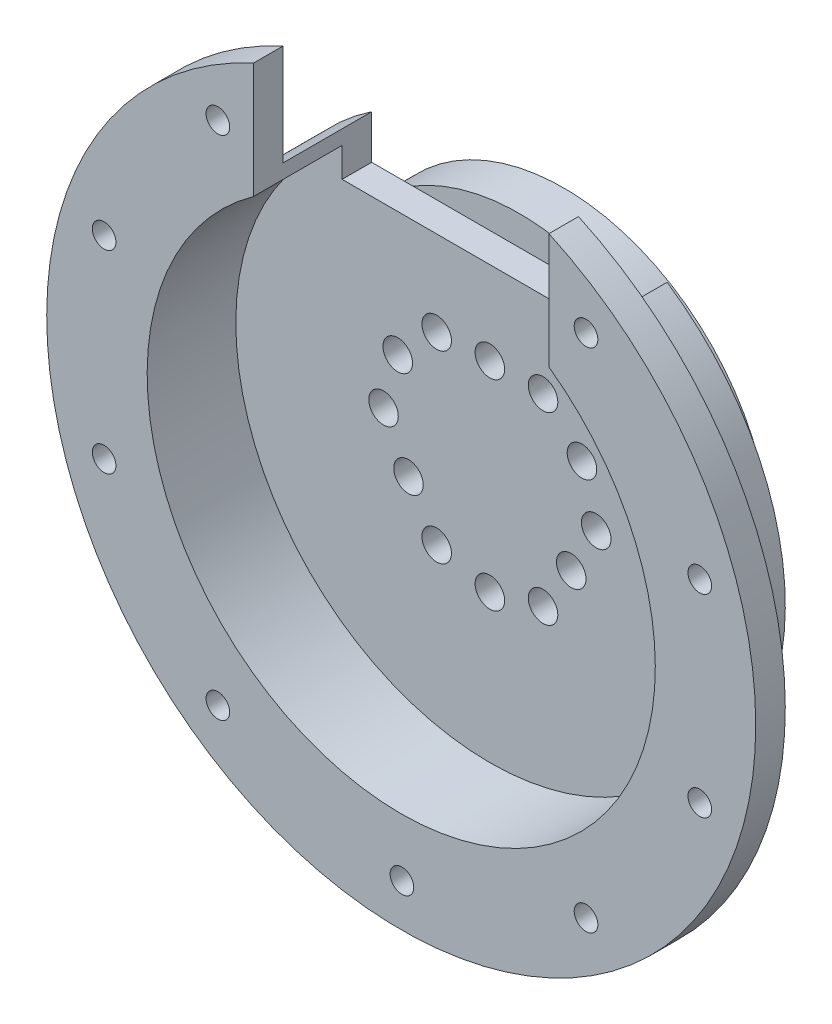
ISO-10303-21;
HEADER;
FILE_DESCRIPTION(('STEP AP214'),'2;1');
FILE_NAME('part.step','',(''),(''),'','','');
FILE_SCHEMA(('AUTOMOTIVE_DESIGN { 1 0 10303 214 1 1 1 1 }'));
ENDSEC;
DATA;
#1=APPLICATION_CONTEXT('core data for automotive mechanical design processes');
#2=APPLICATION_PROTOCOL_DEFINITION('international standard','automotive_design',2000,#1);
#3=PRODUCT_CONTEXT('',#1,'mechanical');
#4=PRODUCT('Part','Part','',(#3));
#5=PRODUCT_RELATED_PRODUCT_CATEGORY('part','',(#4));
#6=PRODUCT_DEFINITION_FORMATION('','',#4);
#7=PRODUCT_DEFINITION_CONTEXT('part definition',#1,'design');
#8=PRODUCT_DEFINITION('design','',#6,#7);
#9=PRODUCT_DEFINITION_SHAPE('','',#8);
#10=(LENGTH_UNIT() NAMED_UNIT(*) SI_UNIT(.MILLI.,.METRE.));
#11=(NAMED_UNIT(*) PLANE_ANGLE_UNIT() SI_UNIT($,.RADIAN.));
#12=(NAMED_UNIT(*) SI_UNIT($,.STERADIAN.) SOLID_ANGLE_UNIT());
#13=UNCERTAINTY_MEASURE_WITH_UNIT(LENGTH_MEASURE(1.E-05),#10,'distance_accuracy_value','');
#14=(GEOMETRIC_REPRESENTATION_CONTEXT(3) GLOBAL_UNCERTAINTY_ASSIGNED_CONTEXT((#13)) GLOBAL_UNIT_ASSIGNED_CONTEXT((#10,
#11,#12)) REPRESENTATION_CONTEXT('',''));
#15=CARTESIAN_POINT('',(0.,0.,0.));
#16=DIRECTION('',(0.,0.,1.));
#17=DIRECTION('',(1.,0.,0.));
#18=AXIS2_PLACEMENT_3D('',#15,#16,#17);
#19=CARTESIAN_POINT('',(0.,0.,5.));
#20=DIRECTION('',(0.,0.,1.));
#21=DIRECTION('',(1.,0.,0.));
#22=AXIS2_PLACEMENT_3D('',#19,#20,#21);
#23=PLANE('',#22);
#24=CARTESIAN_POINT('',(0.,15.9,5.));
#25=DIRECTION('',(0.,0.,1.));
#26=DIRECTION('',(1.,0.,0.));
#27=AXIS2_PLACEMENT_3D('',#24,#25,#26);
#28=CIRCLE('',#27,2.5);
#29=CARTESIAN_POINT('',(2.5,15.9,5.));
#30=VERTEX_POINT('',#29);
#31=EDGE_CURVE('E266',#30,#30,#28,.T.);
#32=ORIENTED_EDGE('',*,*,#31,.F.);
#33=EDGE_LOOP('',(#32));
#34=FACE_BOUND('',#33,.T.);
#35=CARTESIAN_POINT('',(-9.00000000000028,15.5884572681197,5.));
#36=DIRECTION('',(0.,0.,1.));
#37=DIRECTION('',(1.,0.,0.));
#38=AXIS2_PLACEMENT_3D('',#35,#36,#37);
#39=CIRCLE('',#38,2.50000000000036);
#40=CARTESIAN_POINT('',(-6.49999999999992,15.5884572681197,5.));
#41=VERTEX_POINT('',#40);
#42=EDGE_CURVE('E235',#41,#41,#39,.T.);
#43=ORIENTED_EDGE('',*,*,#42,.F.);
#44=EDGE_LOOP('',(#43));
#45=FACE_BOUND('',#44,.T.);
#46=CARTESIAN_POINT('',(-15.5884572681199,8.99999999999926,5.));
#47=DIRECTION('',(0.,0.,1.));
#48=DIRECTION('',(1.,0.,0.));
#49=AXIS2_PLACEMENT_3D('',#46,#47,#48);
#50=CIRCLE('',#49,2.50000000000085);
#51=CARTESIAN_POINT('',(-13.088457268119,8.99999999999926,5.));
#52=VERTEX_POINT('',#51);
#53=EDGE_CURVE('E240',#52,#52,#50,.T.);
#54=ORIENTED_EDGE('',*,*,#53,.F.);
#55=EDGE_LOOP('',(#54));
#56=FACE_BOUND('',#55,.T.);
#57=CARTESIAN_POINT('',(-17.9999999999993,-1.13466467721258E-12,5.));
#58=DIRECTION('',(0.,0.,1.));
#59=DIRECTION('',(1.,0.,0.));
#60=AXIS2_PLACEMENT_3D('',#57,#58,#59);
#61=CIRCLE('',#60,2.50000000000138);
#62=CARTESIAN_POINT('',(-15.499999999998,-1.13466467721258E-12,5.));
#63=VERTEX_POINT('',#62);
#64=EDGE_CURVE('E236',#63,#63,#61,.T.);
#65=ORIENTED_EDGE('',*,*,#64,.F.);
#66=EDGE_LOOP('',(#65));
#67=FACE_BOUND('',#66,.T.);
#68=CARTESIAN_POINT('',(15.5884572681206,9.00000000000035,5.));
#69=DIRECTION('',(0.,0.,1.));
#70=DIRECTION('',(1.,0.,0.));
#71=AXIS2_PLACEMENT_3D('',#68,#69,#70);
#72=CIRCLE('',#71,2.49999999999944);
#73=CARTESIAN_POINT('',(18.08845726812,9.00000000000035,5.));
#74=VERTEX_POINT('',#73);
#75=EDGE_CURVE('E248',#74,#74,#72,.T.);
#76=ORIENTED_EDGE('',*,*,#75,.F.);
#77=EDGE_LOOP('',(#76));
#78=FACE_BOUND('',#77,.T.);
#79=CARTESIAN_POINT('',(-13.7698039201709,-7.95000000000098,5.));
#80=DIRECTION('',(0.,0.,1.));
#81=DIRECTION('',(1.,0.,0.));
#82=AXIS2_PLACEMENT_3D('',#79,#80,#81);
#83=CIRCLE('',#82,2.50000000000204);
#84=CARTESIAN_POINT('',(-11.2698039201688,-7.95000000000098,5.));
#85=VERTEX_POINT('',#84);
#86=EDGE_CURVE('E257',#85,#85,#83,.T.);
#87=ORIENTED_EDGE('',*,*,#86,.F.);
#88=EDGE_LOOP('',(#87));
#89=FACE_BOUND('',#88,.T.);
#90=CARTESIAN_POINT('',(13.7698039201743,-7.94999999999901,5.));
#91=DIRECTION('',(0.,0.,1.));
#92=DIRECTION('',(1.,0.,0.));
#93=AXIS2_PLACEMENT_3D('',#90,#91,#92);
#94=CIRCLE('',#93,2.50000000000142);
#95=CARTESIAN_POINT('',(16.2698039201757,-7.94999999999901,5.));
#96=VERTEX_POINT('',#95);
#97=EDGE_CURVE('E260',#96,#96,#94,.T.);
#98=ORIENTED_EDGE('',*,*,#97,.F.);
#99=EDGE_LOOP('',(#98));
#100=FACE_BOUND('',#99,.T.);
#101=CARTESIAN_POINT('',(9.00000000000002,15.5884572681199,5.));
#102=DIRECTION('',(0.,0.,1.));
#103=DIRECTION('',(1.,0.,0.));
#104=AXIS2_PLACEMENT_3D('',#101,#102,#103);
#105=CIRCLE('',#104,2.5);
#106=CARTESIAN_POINT('',(11.5,15.5884572681199,5.));
#107=VERTEX_POINT('',#106);
#108=EDGE_CURVE('E263',#107,#107,#105,.T.);
#109=ORIENTED_EDGE('',*,*,#108,.F.);
#110=EDGE_LOOP('',(#109));
#111=FACE_BOUND('',#110,.T.);
#112=CARTESIAN_POINT('',(18.0000000000013,2.98451076838273E-13,5.));
#113=DIRECTION('',(0.,0.,1.));
#114=DIRECTION('',(1.,0.,0.));
#115=AXIS2_PLACEMENT_3D('',#112,#113,#114);
#116=CIRCLE('',#115,2.49999999999927);
#117=CARTESIAN_POINT('',(20.5000000000006,2.98451076838273E-13,5.));
#118=VERTEX_POINT('',#117);
#119=EDGE_CURVE('E245',#118,#118,#116,.T.);
#120=ORIENTED_EDGE('',*,*,#119,.F.);
#121=EDGE_LOOP('',(#120));
#122=FACE_BOUND('',#121,.T.);
#123=CARTESIAN_POINT('',(9.00000000000131,-15.5884572681199,5.));
#124=DIRECTION('',(0.,0.,1.));
#125=DIRECTION('',(1.,0.,0.));
#126=AXIS2_PLACEMENT_3D('',#123,#124,#125);
#127=CIRCLE('',#126,2.50000000000036);
#128=CARTESIAN_POINT('',(11.5000000000017,-15.5884572681199,5.));
#129=VERTEX_POINT('',#128);
#130=EDGE_CURVE('E249',#129,#129,#127,.T.);
#131=ORIENTED_EDGE('',*,*,#130,.F.);
#132=EDGE_LOOP('',(#131));
#133=FACE_BOUND('',#132,.T.);
#134=CARTESIAN_POINT('',(1.28825325164736E-12,-18.0000000000008,5.));
#135=DIRECTION('',(0.,0.,1.));
#136=DIRECTION('',(1.,0.,0.));
#137=AXIS2_PLACEMENT_3D('',#134,#135,#136);
#138=CIRCLE('',#137,2.50000000000041);
#139=CARTESIAN_POINT('',(2.50000000000169,-18.0000000000008,5.));
#140=VERTEX_POINT('',#139);
#141=EDGE_CURVE('E252',#140,#140,#138,.T.);
#142=ORIENTED_EDGE('',*,*,#141,.F.);
#143=EDGE_LOOP('',(#142));
#144=FACE_BOUND('',#143,.T.);
#145=CARTESIAN_POINT('',(-8.99999999999908,-15.5884572681212,5.));
#146=DIRECTION('',(0.,0.,1.));
#147=DIRECTION('',(1.,0.,0.));
#148=AXIS2_PLACEMENT_3D('',#145,#146,#147);
#149=CIRCLE('',#148,2.5000000000006);
#150=CARTESIAN_POINT('',(-6.49999999999848,-15.5884572681212,5.));
#151=VERTEX_POINT('',#150);
#152=EDGE_CURVE('E239',#151,#151,#149,.T.);
#153=ORIENTED_EDGE('',*,*,#152,.F.);
#154=EDGE_LOOP('',(#153));
#155=FACE_BOUND('',#154,.T.);
#156=CARTESIAN_POINT('',(0.,0.,5.));
#157=DIRECTION('',(0.,0.,1.));
#158=DIRECTION('',(1.,0.,0.));
#159=AXIS2_PLACEMENT_3D('',#156,#157,#158);
#160=CIRCLE('',#159,43.);
#161=CARTESIAN_POINT('',(25.,34.9857113690718,5.));
#162=VERTEX_POINT('',#161);
#163=CARTESIAN_POINT('',(-25.,34.9857113690718,5.));
#164=VERTEX_POINT('',#163);
#165=EDGE_CURVE('E274',#162,#164,#160,.F.);
#166=ORIENTED_EDGE('',*,*,#165,.F.);
#167=DIRECTION('',(0.,-1.,0.));
#168=VECTOR('',#167,1.);
#169=CARTESIAN_POINT('',(25.,0.,5.));
#170=LINE('',#169,#168);
#171=CARTESIAN_POINT('',(25.,30.,5.));
#172=VERTEX_POINT('',#171);
#173=EDGE_CURVE('E161',#162,#172,#170,.T.);
#174=ORIENTED_EDGE('',*,*,#173,.T.);
#175=DIRECTION('',(-1.,0.,0.));
#176=VECTOR('',#175,1.);
#177=CARTESIAN_POINT('',(0.,30.,5.));
#178=LINE('',#177,#176);
#179=CARTESIAN_POINT('',(-25.,30.,5.));
#180=VERTEX_POINT('',#179);
#181=EDGE_CURVE('E166',#172,#180,#178,.T.);
#182=ORIENTED_EDGE('',*,*,#181,.T.);
#183=DIRECTION('',(0.,1.,0.));
#184=VECTOR('',#183,1.);
#185=CARTESIAN_POINT('',(-25.,0.,5.));
#186=LINE('',#185,#184);
#187=EDGE_CURVE('E147',#180,#164,#186,.T.);
#188=ORIENTED_EDGE('',*,*,#187,.T.);
#189=EDGE_LOOP('',(#166,#174,#182,#188));
#190=FACE_BOUND('',#189,.T.);
#191=ADVANCED_FACE('F37',(#34,#45,#56,#67,#78,#89,#100,#111,#122,#133,#144,#155,#190),#23,.T.);
#192=CARTESIAN_POINT('',(0.,0.,5.));
#193=DIRECTION('',(0.,0.,-1.));
#194=DIRECTION('',(-1.,0.,0.));
#195=AXIS2_PLACEMENT_3D('',#192,#193,#194);
#196=CYLINDRICAL_SURFACE('',#195,45.);
#197=DIRECTION('',(0.,0.,-1.));
#198=VECTOR('',#197,1.);
#199=CARTESIAN_POINT('',(25.,37.4165738677394,4.99999999999999));
#200=LINE('',#199,#198);
#201=CARTESIAN_POINT('',(25.,37.4165738677394,15.));
#202=VERTEX_POINT('',#201);
#203=CARTESIAN_POINT('',(25.,37.4165738677394,0.));
#204=VERTEX_POINT('',#203);
#205=EDGE_CURVE('E159',#202,#204,#200,.T.);
#206=ORIENTED_EDGE('',*,*,#205,.F.);
#207=CARTESIAN_POINT('',(0.,0.,15.));
#208=DIRECTION('',(0.,0.,1.));
#209=DIRECTION('',(1.,0.,0.));
#210=AXIS2_PLACEMENT_3D('',#207,#208,#209);
#211=CIRCLE('',#210,45.);
#212=CARTESIAN_POINT('',(-25.,37.4165738677394,15.));
#213=VERTEX_POINT('',#212);
#214=EDGE_CURVE('E230',#213,#202,#211,.T.);
#215=ORIENTED_EDGE('',*,*,#214,.F.);
#216=DIRECTION('',(0.,0.,-1.));
#217=VECTOR('',#216,1.);
#218=CARTESIAN_POINT('',(-25.,37.4165738677394,5.));
#219=LINE('',#218,#217);
#220=CARTESIAN_POINT('',(-25.,37.4165738677394,0.));
#221=VERTEX_POINT('',#220);
#222=EDGE_CURVE('E145',#221,#213,#219,.F.);
#223=ORIENTED_EDGE('',*,*,#222,.F.);
#224=CARTESIAN_POINT('',(0.,0.,0.));
#225=DIRECTION('',(0.,0.,1.));
#226=DIRECTION('',(1.,0.,0.));
#227=AXIS2_PLACEMENT_3D('',#224,#225,#226);
#228=CIRCLE('',#227,45.);
#229=EDGE_CURVE('E271',#221,#204,#228,.T.);
#230=ORIENTED_EDGE('',*,*,#229,.T.);
#231=EDGE_LOOP('',(#206,#215,#223,#230));
#232=FACE_BOUND('',#231,.T.);
#233=ADVANCED_FACE('F39',(#232),#196,.T.);
#234=CARTESIAN_POINT('',(0.,0.,0.));
#235=DIRECTION('',(0.,0.,1.));
#236=DIRECTION('',(1.,0.,0.));
#237=AXIS2_PLACEMENT_3D('',#234,#235,#236);
#238=PLANE('',#237);
#239=CARTESIAN_POINT('',(0.,0.,0.));
#240=DIRECTION('',(0.,0.,-1.));
#241=DIRECTION('',(-1.,0.,0.));
#242=AXIS2_PLACEMENT_3D('',#239,#240,#241);
#243=CIRCLE('',#242,35.);
#244=CARTESIAN_POINT('',(18.02775637732,30.,0.));
#245=VERTEX_POINT('',#244);
#246=CARTESIAN_POINT('',(-18.02775637732,30.,0.));
#247=VERTEX_POINT('',#246);
#248=EDGE_CURVE('E11',#245,#247,#243,.T.);
#249=ORIENTED_EDGE('',*,*,#248,.F.);
#250=DIRECTION('',(-1.,0.,0.));
#251=VECTOR('',#250,1.);
#252=CARTESIAN_POINT('',(0.,30.,0.));
#253=LINE('',#252,#251);
#254=CARTESIAN_POINT('',(25.,30.,0.));
#255=VERTEX_POINT('',#254);
#256=EDGE_CURVE('E41',#255,#245,#253,.T.);
#257=ORIENTED_EDGE('',*,*,#256,.F.);
#258=DIRECTION('',(0.,-1.,0.));
#259=VECTOR('',#258,1.);
#260=CARTESIAN_POINT('',(25.,0.,0.));
#261=LINE('',#260,#259);
#262=EDGE_CURVE('E164',#204,#255,#261,.T.);
#263=ORIENTED_EDGE('',*,*,#262,.F.);
#264=ORIENTED_EDGE('',*,*,#229,.F.);
#265=DIRECTION('',(0.,1.,0.));
#266=VECTOR('',#265,1.);
#267=CARTESIAN_POINT('',(-25.,0.,0.));
#268=LINE('',#267,#266);
#269=CARTESIAN_POINT('',(-25.,30.,0.));
#270=VERTEX_POINT('',#269);
#271=EDGE_CURVE('E121',#270,#221,#268,.T.);
#272=ORIENTED_EDGE('',*,*,#271,.F.);
#273=EDGE_CURVE('E113',#247,#270,#253,.T.);
#274=ORIENTED_EDGE('',*,*,#273,.F.);
#275=EDGE_LOOP('',(#249,#257,#263,#264,#272,#274));
#276=FACE_BOUND('',#275,.T.);
#277=ADVANCED_FACE('F119',(#276),#238,.F.);
#278=CARTESIAN_POINT('',(0.,0.,15.));
#279=DIRECTION('',(0.,0.,-1.));
#280=DIRECTION('',(-1.,0.,0.));
#281=AXIS2_PLACEMENT_3D('',#278,#279,#280);
#282=CYLINDRICAL_SURFACE('',#281,43.);
#283=CARTESIAN_POINT('',(0.,0.,20.));
#284=DIRECTION('',(0.,0.,1.));
#285=DIRECTION('',(1.,0.,0.));
#286=AXIS2_PLACEMENT_3D('',#283,#284,#285);
#287=CIRCLE('',#286,43.);
#288=CARTESIAN_POINT('',(-25.,34.9857113690718,20.));
#289=VERTEX_POINT('',#288);
#290=CARTESIAN_POINT('',(25.,34.9857113690718,20.));
#291=VERTEX_POINT('',#290);
#292=EDGE_CURVE('E179',#289,#291,#287,.T.);
#293=ORIENTED_EDGE('',*,*,#292,.T.);
#294=DIRECTION('',(0.,0.,-1.));
#295=VECTOR('',#294,1.);
#296=CARTESIAN_POINT('',(25.,34.9857113690718,15.));
#297=LINE('',#296,#295);
#298=EDGE_CURVE('E156',#291,#162,#297,.T.);
#299=ORIENTED_EDGE('',*,*,#298,.T.);
#300=ORIENTED_EDGE('',*,*,#165,.T.);
#301=DIRECTION('',(0.,0.,-1.));
#302=VECTOR('',#301,1.);
#303=CARTESIAN_POINT('',(-25.,34.9857113690718,15.));
#304=LINE('',#303,#302);
#305=EDGE_CURVE('E142',#164,#289,#304,.F.);
#306=ORIENTED_EDGE('',*,*,#305,.T.);
#307=EDGE_LOOP('',(#293,#299,#300,#306));
#308=FACE_BOUND('',#307,.T.);
#309=ADVANCED_FACE('F295',(#308),#282,.F.);
#310=CARTESIAN_POINT('',(0.,0.,20.));
#311=DIRECTION('',(0.,0.,1.));
#312=DIRECTION('',(1.,0.,0.));
#313=AXIS2_PLACEMENT_3D('',#310,#311,#312);
#314=PLANE('',#313);
#315=CARTESIAN_POINT('',(31.2742071689723,43.1431440858981,20.));
#316=DIRECTION('',(0.,0.,1.));
#317=DIRECTION('',(1.,0.,0.));
#318=AXIS2_PLACEMENT_3D('',#315,#316,#317);
#319=CIRCLE('',#318,2.);
#320=CARTESIAN_POINT('',(33.2742071689723,43.1431440858981,20.));
#321=VERTEX_POINT('',#320);
#322=EDGE_CURVE('E176',#321,#321,#319,.T.);
#323=ORIENTED_EDGE('',*,*,#322,.F.);
#324=EDGE_LOOP('',(#323));
#325=FACE_BOUND('',#324,.T.);
#326=CARTESIAN_POINT('',(50.5275841611265,16.6431440859068,20.));
#327=DIRECTION('',(0.,0.,1.));
#328=DIRECTION('',(1.,0.,0.));
#329=AXIS2_PLACEMENT_3D('',#326,#327,#328);
#330=CIRCLE('',#329,2.);
#331=CARTESIAN_POINT('',(52.5275841611265,16.6431440859068,20.));
#332=VERTEX_POINT('',#331);
#333=EDGE_CURVE('E183',#332,#332,#330,.T.);
#334=ORIENTED_EDGE('',*,*,#333,.F.);
#335=EDGE_LOOP('',(#334));
#336=FACE_BOUND('',#335,.T.);
#337=CARTESIAN_POINT('',(50.5275841611413,-16.1126573178377,20.));
#338=DIRECTION('',(0.,0.,1.));
#339=DIRECTION('',(1.,0.,0.));
#340=AXIS2_PLACEMENT_3D('',#337,#338,#339);
#341=CIRCLE('',#340,2.);
#342=CARTESIAN_POINT('',(52.5275841611413,-16.1126573178377,20.));
#343=VERTEX_POINT('',#342);
#344=EDGE_CURVE('E189',#343,#343,#341,.T.);
#345=ORIENTED_EDGE('',*,*,#344,.F.);
#346=EDGE_LOOP('',(#345));
#347=FACE_BOUND('',#346,.T.);
#348=CARTESIAN_POINT('',(31.2742071690112,-42.6126573178465,20.));
#349=DIRECTION('',(0.,0.,1.));
#350=DIRECTION('',(1.,0.,0.));
#351=AXIS2_PLACEMENT_3D('',#348,#349,#350);
#352=CIRCLE('',#351,2.);
#353=CARTESIAN_POINT('',(33.2742071690112,-42.6126573178465,20.));
#354=VERTEX_POINT('',#353);
#355=EDGE_CURVE('E195',#354,#354,#352,.T.);
#356=ORIENTED_EDGE('',*,*,#355,.F.);
#357=EDGE_LOOP('',(#356));
#358=FACE_BOUND('',#357,.T.);
#359=CARTESIAN_POINT('',(0.121588797514564,-52.7347566159883,20.));
#360=DIRECTION('',(0.,0.,1.));
#361=DIRECTION('',(1.,0.,0.));
#362=AXIS2_PLACEMENT_3D('',#359,#360,#361);
#363=CIRCLE('',#362,2.);
#364=CARTESIAN_POINT('',(2.12158879751456,-52.7347566159883,20.));
#365=VERTEX_POINT('',#364);
#366=EDGE_CURVE('E201',#365,#365,#363,.T.);
#367=ORIENTED_EDGE('',*,*,#366,.F.);
#368=EDGE_LOOP('',(#367));
#369=FACE_BOUND('',#368,.T.);
#370=CARTESIAN_POINT('',(-31.0310295739911,-42.6126573178744,20.));
#371=DIRECTION('',(0.,0.,1.));
#372=DIRECTION('',(1.,0.,0.));
#373=AXIS2_PLACEMENT_3D('',#370,#371,#372);
#374=CIRCLE('',#373,2.);
#375=CARTESIAN_POINT('',(-29.0310295739911,-42.6126573178744,20.));
#376=VERTEX_POINT('',#375);
#377=EDGE_CURVE('E207',#376,#376,#374,.T.);
#378=ORIENTED_EDGE('',*,*,#377,.F.);
#379=EDGE_LOOP('',(#378));
#380=FACE_BOUND('',#379,.T.);
#381=CARTESIAN_POINT('',(-50.2844065661451,-16.112657317883,20.));
#382=DIRECTION('',(0.,0.,1.));
#383=DIRECTION('',(1.,0.,0.));
#384=AXIS2_PLACEMENT_3D('',#381,#382,#383);
#385=CIRCLE('',#384,2.);
#386=CARTESIAN_POINT('',(-48.2844065661451,-16.112657317883,20.));
#387=VERTEX_POINT('',#386);
#388=EDGE_CURVE('E213',#387,#387,#385,.T.);
#389=ORIENTED_EDGE('',*,*,#388,.F.);
#390=EDGE_LOOP('',(#389));
#391=FACE_BOUND('',#390,.T.);
#392=CARTESIAN_POINT('',(-50.2844065661597,16.6431440858615,20.));
#393=DIRECTION('',(0.,0.,1.));
#394=DIRECTION('',(1.,0.,0.));
#395=AXIS2_PLACEMENT_3D('',#392,#393,#394);
#396=CIRCLE('',#395,2.);
#397=CARTESIAN_POINT('',(-48.2844065661597,16.6431440858615,20.));
#398=VERTEX_POINT('',#397);
#399=EDGE_CURVE('E219',#398,#398,#396,.T.);
#400=ORIENTED_EDGE('',*,*,#399,.F.);
#401=EDGE_LOOP('',(#400));
#402=FACE_BOUND('',#401,.T.);
#403=CARTESIAN_POINT('',(-31.0310295740293,43.1431440858701,20.));
#404=DIRECTION('',(0.,0.,1.));
#405=DIRECTION('',(1.,0.,0.));
#406=AXIS2_PLACEMENT_3D('',#403,#404,#405);
#407=CIRCLE('',#406,2.);
#408=CARTESIAN_POINT('',(-29.0310295740293,43.1431440858701,20.));
#409=VERTEX_POINT('',#408);
#410=EDGE_CURVE('E170',#409,#409,#407,.T.);
#411=ORIENTED_EDGE('',*,*,#410,.F.);
#412=EDGE_LOOP('',(#411));
#413=FACE_BOUND('',#412,.T.);
#414=CARTESIAN_POINT('',(0.,0.,20.));
#415=DIRECTION('',(0.,0.,1.));
#416=DIRECTION('',(1.,0.,0.));
#417=AXIS2_PLACEMENT_3D('',#414,#415,#416);
#418=CIRCLE('',#417,60.);
#419=CARTESIAN_POINT('',(-25.,54.5435605731786,20.));
#420=VERTEX_POINT('',#419);
#421=CARTESIAN_POINT('',(25.,54.5435605731786,20.));
#422=VERTEX_POINT('',#421);
#423=EDGE_CURVE('E227',#420,#422,#418,.T.);
#424=ORIENTED_EDGE('',*,*,#423,.T.);
#425=DIRECTION('',(0.,-1.,0.));
#426=VECTOR('',#425,1.);
#427=CARTESIAN_POINT('',(25.,0.,20.));
#428=LINE('',#427,#426);
#429=EDGE_CURVE('E153',#422,#291,#428,.T.);
#430=ORIENTED_EDGE('',*,*,#429,.T.);
#431=ORIENTED_EDGE('',*,*,#292,.F.);
#432=DIRECTION('',(0.,1.,0.));
#433=VECTOR('',#432,1.);
#434=CARTESIAN_POINT('',(-25.,0.,20.));
#435=LINE('',#434,#433);
#436=EDGE_CURVE('E139',#289,#420,#435,.T.);
#437=ORIENTED_EDGE('',*,*,#436,.T.);
#438=EDGE_LOOP('',(#424,#430,#431,#437));
#439=FACE_BOUND('',#438,.T.);
#440=ADVANCED_FACE('F293',(#325,#336,#347,#358,#369,#380,#391,#402,#413,#439),#314,.T.);
#441=CARTESIAN_POINT('',(0.,0.,15.));
#442=DIRECTION('',(0.,0.,1.));
#443=DIRECTION('',(1.,0.,0.));
#444=AXIS2_PLACEMENT_3D('',#441,#442,#443);
#445=PLANE('',#444);
#446=CARTESIAN_POINT('',(31.2742071689723,43.1431440858981,15.));
#447=DIRECTION('',(0.,0.,1.));
#448=DIRECTION('',(1.,0.,0.));
#449=AXIS2_PLACEMENT_3D('',#446,#447,#448);
#450=CIRCLE('',#449,2.);
#451=CARTESIAN_POINT('',(33.2742071689723,43.1431440858981,15.));
#452=VERTEX_POINT('',#451);
#453=EDGE_CURVE('E180',#452,#452,#450,.T.);
#454=ORIENTED_EDGE('',*,*,#453,.T.);
#455=EDGE_LOOP('',(#454));
#456=FACE_BOUND('',#455,.T.);
#457=CARTESIAN_POINT('',(50.5275841611265,16.6431440859068,15.));
#458=DIRECTION('',(0.,0.,1.));
#459=DIRECTION('',(1.,0.,0.));
#460=AXIS2_PLACEMENT_3D('',#457,#458,#459);
#461=CIRCLE('',#460,2.);
#462=CARTESIAN_POINT('',(52.5275841611265,16.6431440859068,15.));
#463=VERTEX_POINT('',#462);
#464=EDGE_CURVE('E186',#463,#463,#461,.T.);
#465=ORIENTED_EDGE('',*,*,#464,.T.);
#466=EDGE_LOOP('',(#465));
#467=FACE_BOUND('',#466,.T.);
#468=CARTESIAN_POINT('',(50.5275841611413,-16.1126573178377,15.));
#469=DIRECTION('',(0.,0.,1.));
#470=DIRECTION('',(1.,0.,0.));
#471=AXIS2_PLACEMENT_3D('',#468,#469,#470);
#472=CIRCLE('',#471,2.);
#473=CARTESIAN_POINT('',(52.5275841611413,-16.1126573178377,15.));
#474=VERTEX_POINT('',#473);
#475=EDGE_CURVE('E192',#474,#474,#472,.T.);
#476=ORIENTED_EDGE('',*,*,#475,.T.);
#477=EDGE_LOOP('',(#476));
#478=FACE_BOUND('',#477,.T.);
#479=CARTESIAN_POINT('',(31.2742071690112,-42.6126573178465,15.));
#480=DIRECTION('',(0.,0.,1.));
#481=DIRECTION('',(1.,0.,0.));
#482=AXIS2_PLACEMENT_3D('',#479,#480,#481);
#483=CIRCLE('',#482,2.);
#484=CARTESIAN_POINT('',(33.2742071690112,-42.6126573178465,15.));
#485=VERTEX_POINT('',#484);
#486=EDGE_CURVE('E198',#485,#485,#483,.T.);
#487=ORIENTED_EDGE('',*,*,#486,.T.);
#488=EDGE_LOOP('',(#487));
#489=FACE_BOUND('',#488,.T.);
#490=CARTESIAN_POINT('',(0.121588797514564,-52.7347566159883,15.));
#491=DIRECTION('',(0.,0.,1.));
#492=DIRECTION('',(1.,0.,0.));
#493=AXIS2_PLACEMENT_3D('',#490,#491,#492);
#494=CIRCLE('',#493,2.);
#495=CARTESIAN_POINT('',(2.12158879751456,-52.7347566159883,15.));
#496=VERTEX_POINT('',#495);
#497=EDGE_CURVE('E204',#496,#496,#494,.T.);
#498=ORIENTED_EDGE('',*,*,#497,.T.);
#499=EDGE_LOOP('',(#498));
#500=FACE_BOUND('',#499,.T.);
#501=CARTESIAN_POINT('',(-31.0310295739911,-42.6126573178744,15.));
#502=DIRECTION('',(0.,0.,1.));
#503=DIRECTION('',(1.,0.,0.));
#504=AXIS2_PLACEMENT_3D('',#501,#502,#503);
#505=CIRCLE('',#504,2.);
#506=CARTESIAN_POINT('',(-29.0310295739911,-42.6126573178744,15.));
#507=VERTEX_POINT('',#506);
#508=EDGE_CURVE('E210',#507,#507,#505,.T.);
#509=ORIENTED_EDGE('',*,*,#508,.T.);
#510=EDGE_LOOP('',(#509));
#511=FACE_BOUND('',#510,.T.);
#512=CARTESIAN_POINT('',(-50.2844065661451,-16.112657317883,15.));
#513=DIRECTION('',(0.,0.,1.));
#514=DIRECTION('',(1.,0.,0.));
#515=AXIS2_PLACEMENT_3D('',#512,#513,#514);
#516=CIRCLE('',#515,2.);
#517=CARTESIAN_POINT('',(-48.2844065661451,-16.112657317883,15.));
#518=VERTEX_POINT('',#517);
#519=EDGE_CURVE('E216',#518,#518,#516,.T.);
#520=ORIENTED_EDGE('',*,*,#519,.T.);
#521=EDGE_LOOP('',(#520));
#522=FACE_BOUND('',#521,.T.);
#523=CARTESIAN_POINT('',(-50.2844065661597,16.6431440858615,15.));
#524=DIRECTION('',(0.,0.,1.));
#525=DIRECTION('',(1.,0.,0.));
#526=AXIS2_PLACEMENT_3D('',#523,#524,#525);
#527=CIRCLE('',#526,2.);
#528=CARTESIAN_POINT('',(-48.2844065661597,16.6431440858615,15.));
#529=VERTEX_POINT('',#528);
#530=EDGE_CURVE('E173',#529,#529,#527,.T.);
#531=ORIENTED_EDGE('',*,*,#530,.T.);
#532=EDGE_LOOP('',(#531));
#533=FACE_BOUND('',#532,.T.);
#534=CARTESIAN_POINT('',(-31.0310295740293,43.1431440858701,15.));
#535=DIRECTION('',(0.,0.,1.));
#536=DIRECTION('',(1.,0.,0.));
#537=AXIS2_PLACEMENT_3D('',#534,#535,#536);
#538=CIRCLE('',#537,2.);
#539=CARTESIAN_POINT('',(-29.0310295740293,43.1431440858701,15.));
#540=VERTEX_POINT('',#539);
#541=EDGE_CURVE('E169',#540,#540,#538,.T.);
#542=ORIENTED_EDGE('',*,*,#541,.T.);
#543=EDGE_LOOP('',(#542));
#544=FACE_BOUND('',#543,.T.);
#545=DIRECTION('',(0.,-1.,0.));
#546=VECTOR('',#545,1.);
#547=CARTESIAN_POINT('',(25.,0.,15.));
#548=LINE('',#547,#546);
#549=CARTESIAN_POINT('',(25.,54.5435605731786,15.));
#550=VERTEX_POINT('',#549);
#551=EDGE_CURVE('E151',#550,#202,#548,.T.);
#552=ORIENTED_EDGE('',*,*,#551,.F.);
#553=CARTESIAN_POINT('',(0.,0.,15.));
#554=DIRECTION('',(0.,0.,1.));
#555=DIRECTION('',(1.,0.,0.));
#556=AXIS2_PLACEMENT_3D('',#553,#554,#555);
#557=CIRCLE('',#556,60.);
#558=CARTESIAN_POINT('',(-25.,54.5435605731786,15.));
#559=VERTEX_POINT('',#558);
#560=EDGE_CURVE('E226',#559,#550,#557,.T.);
#561=ORIENTED_EDGE('',*,*,#560,.F.);
#562=DIRECTION('',(0.,1.,0.));
#563=VECTOR('',#562,1.);
#564=CARTESIAN_POINT('',(-25.,0.,15.));
#565=LINE('',#564,#563);
#566=EDGE_CURVE('E60',#213,#559,#565,.T.);
#567=ORIENTED_EDGE('',*,*,#566,.F.);
#568=ORIENTED_EDGE('',*,*,#214,.T.);
#569=EDGE_LOOP('',(#552,#561,#567,#568));
#570=FACE_BOUND('',#569,.T.);
#571=ADVANCED_FACE('F287',(#456,#467,#478,#489,#500,#511,#522,#533,#544,#570),#445,.F.);
#572=CARTESIAN_POINT('',(0.,0.,20.));
#573=DIRECTION('',(0.,0.,-1.));
#574=DIRECTION('',(-1.,0.,0.));
#575=AXIS2_PLACEMENT_3D('',#572,#573,#574);
#576=CYLINDRICAL_SURFACE('',#575,60.);
#577=DIRECTION('',(0.,0.,-1.));
#578=VECTOR('',#577,1.);
#579=CARTESIAN_POINT('',(25.,54.5435605731786,20.));
#580=LINE('',#579,#578);
#581=EDGE_CURVE('E122',#422,#550,#580,.T.);
#582=ORIENTED_EDGE('',*,*,#581,.F.);
#583=ORIENTED_EDGE('',*,*,#423,.F.);
#584=DIRECTION('',(0.,0.,-1.));
#585=VECTOR('',#584,1.);
#586=CARTESIAN_POINT('',(-25.,54.5435605731786,20.));
#587=LINE('',#586,#585);
#588=EDGE_CURVE('E277',#559,#420,#587,.F.);
#589=ORIENTED_EDGE('',*,*,#588,.F.);
#590=ORIENTED_EDGE('',*,*,#560,.T.);
#591=EDGE_LOOP('',(#582,#583,#589,#590));
#592=FACE_BOUND('',#591,.T.);
#593=ADVANCED_FACE('F289',(#592),#576,.T.);
#594=CARTESIAN_POINT('',(0.,15.9,0.));
#595=DIRECTION('',(0.,0.,1.));
#596=DIRECTION('',(1.,0.,0.));
#597=AXIS2_PLACEMENT_3D('',#594,#595,#596);
#598=CYLINDRICAL_SURFACE('',#597,2.5);
#599=ORIENTED_EDGE('',*,*,#31,.T.);
#600=EDGE_LOOP('',(#599));
#601=FACE_BOUND('',#600,.T.);
#602=CARTESIAN_POINT('',(0.,15.9,-7.5));
#603=DIRECTION('',(0.,0.,-1.));
#604=DIRECTION('',(-1.,0.,0.));
#605=AXIS2_PLACEMENT_3D('',#602,#603,#604);
#606=CIRCLE('',#605,2.5);
#607=CARTESIAN_POINT('',(-2.5,15.9,-7.5));
#608=VERTEX_POINT('',#607);
#609=EDGE_CURVE('E427',#608,#608,#606,.T.);
#610=ORIENTED_EDGE('',*,*,#609,.T.);
#611=EDGE_LOOP('',(#610));
#612=FACE_BOUND('',#611,.T.);
#613=ADVANCED_FACE('F314',(#601,#612),#598,.F.);
#614=CARTESIAN_POINT('',(-9.00000000000028,15.5884572681197,0.));
#615=DIRECTION('',(0.,0.,1.));
#616=DIRECTION('',(1.,0.,0.));
#617=AXIS2_PLACEMENT_3D('',#614,#615,#616);
#618=CYLINDRICAL_SURFACE('',#617,2.50000000000036);
#619=ORIENTED_EDGE('',*,*,#42,.T.);
#620=EDGE_LOOP('',(#619));
#621=FACE_BOUND('',#620,.T.);
#622=CARTESIAN_POINT('',(-9.00000000000028,15.5884572681197,-7.5));
#623=DIRECTION('',(0.,0.,-1.));
#624=DIRECTION('',(-1.,0.,0.));
#625=AXIS2_PLACEMENT_3D('',#622,#623,#624);
#626=CIRCLE('',#625,2.50000000000036);
#627=CARTESIAN_POINT('',(-11.5000000000006,15.5884572681197,-7.5));
#628=VERTEX_POINT('',#627);
#629=EDGE_CURVE('E466',#628,#628,#626,.T.);
#630=ORIENTED_EDGE('',*,*,#629,.T.);
#631=EDGE_LOOP('',(#630));
#632=FACE_BOUND('',#631,.T.);
#633=ADVANCED_FACE('F317',(#621,#632),#618,.F.);
#634=CARTESIAN_POINT('',(-15.5884572681199,8.99999999999926,0.));
#635=DIRECTION('',(0.,0.,1.));
#636=DIRECTION('',(1.,0.,0.));
#637=AXIS2_PLACEMENT_3D('',#634,#635,#636);
#638=CYLINDRICAL_SURFACE('',#637,2.50000000000085);
#639=ORIENTED_EDGE('',*,*,#53,.T.);
#640=EDGE_LOOP('',(#639));
#641=FACE_BOUND('',#640,.T.);
#642=CARTESIAN_POINT('',(-15.5884572681199,8.99999999999926,-7.5));
#643=DIRECTION('',(0.,0.,-1.));
#644=DIRECTION('',(-1.,0.,0.));
#645=AXIS2_PLACEMENT_3D('',#642,#643,#644);
#646=CIRCLE('',#645,2.50000000000085);
#647=CARTESIAN_POINT('',(-18.0884572681207,8.99999999999926,-7.5));
#648=VERTEX_POINT('',#647);
#649=EDGE_CURVE('E431',#648,#648,#646,.T.);
#650=ORIENTED_EDGE('',*,*,#649,.T.);
#651=EDGE_LOOP('',(#650));
#652=FACE_BOUND('',#651,.T.);
#653=ADVANCED_FACE('F355',(#641,#652),#638,.F.);
#654=CARTESIAN_POINT('',(-17.9999999999993,-1.13466467721258E-12,0.));
#655=DIRECTION('',(0.,0.,1.));
#656=DIRECTION('',(1.,0.,0.));
#657=AXIS2_PLACEMENT_3D('',#654,#655,#656);
#658=CYLINDRICAL_SURFACE('',#657,2.50000000000138);
#659=ORIENTED_EDGE('',*,*,#64,.T.);
#660=EDGE_LOOP('',(#659));
#661=FACE_BOUND('',#660,.T.);
#662=CARTESIAN_POINT('',(-17.9999999999993,-1.13466467721258E-12,-7.5));
#663=DIRECTION('',(0.,0.,-1.));
#664=DIRECTION('',(-1.,0.,0.));
#665=AXIS2_PLACEMENT_3D('',#662,#663,#664);
#666=CIRCLE('',#665,2.50000000000138);
#667=CARTESIAN_POINT('',(-20.5000000000007,-1.13466467721258E-12,-7.5));
#668=VERTEX_POINT('',#667);
#669=EDGE_CURVE('E462',#668,#668,#666,.T.);
#670=ORIENTED_EDGE('',*,*,#669,.T.);
#671=EDGE_LOOP('',(#670));
#672=FACE_BOUND('',#671,.T.);
#673=ADVANCED_FACE('F332',(#661,#672),#658,.F.);
#674=CARTESIAN_POINT('',(15.5884572681206,9.00000000000035,0.));
#675=DIRECTION('',(0.,0.,1.));
#676=DIRECTION('',(1.,0.,0.));
#677=AXIS2_PLACEMENT_3D('',#674,#675,#676);
#678=CYLINDRICAL_SURFACE('',#677,2.49999999999944);
#679=ORIENTED_EDGE('',*,*,#75,.T.);
#680=EDGE_LOOP('',(#679));
#681=FACE_BOUND('',#680,.T.);
#682=CARTESIAN_POINT('',(15.5884572681206,9.00000000000035,-7.5));
#683=DIRECTION('',(0.,0.,-1.));
#684=DIRECTION('',(-1.,0.,0.));
#685=AXIS2_PLACEMENT_3D('',#682,#683,#684);
#686=CIRCLE('',#685,2.49999999999944);
#687=CARTESIAN_POINT('',(13.0884572681211,9.00000000000035,-7.5));
#688=VERTEX_POINT('',#687);
#689=EDGE_CURVE('E127',#688,#688,#686,.T.);
#690=ORIENTED_EDGE('',*,*,#689,.T.);
#691=EDGE_LOOP('',(#690));
#692=FACE_BOUND('',#691,.T.);
#693=ADVANCED_FACE('F329',(#681,#692),#678,.F.);
#694=CARTESIAN_POINT('',(-13.7698039201709,-7.95000000000098,0.));
#695=DIRECTION('',(0.,0.,1.));
#696=DIRECTION('',(1.,0.,0.));
#697=AXIS2_PLACEMENT_3D('',#694,#695,#696);
#698=CYLINDRICAL_SURFACE('',#697,2.50000000000204);
#699=ORIENTED_EDGE('',*,*,#86,.T.);
#700=EDGE_LOOP('',(#699));
#701=FACE_BOUND('',#700,.T.);
#702=CARTESIAN_POINT('',(-13.7698039201709,-7.95000000000098,-7.5));
#703=DIRECTION('',(0.,0.,-1.));
#704=DIRECTION('',(-1.,0.,0.));
#705=AXIS2_PLACEMENT_3D('',#702,#703,#704);
#706=CIRCLE('',#705,2.50000000000204);
#707=CARTESIAN_POINT('',(-16.2698039201729,-7.95000000000098,-7.5));
#708=VERTEX_POINT('',#707);
#709=EDGE_CURVE('E435',#708,#708,#706,.T.);
#710=ORIENTED_EDGE('',*,*,#709,.T.);
#711=EDGE_LOOP('',(#710));
#712=FACE_BOUND('',#711,.T.);
#713=ADVANCED_FACE('F323',(#701,#712),#698,.F.);
#714=CARTESIAN_POINT('',(13.7698039201743,-7.94999999999901,0.));
#715=DIRECTION('',(0.,0.,1.));
#716=DIRECTION('',(1.,0.,0.));
#717=AXIS2_PLACEMENT_3D('',#714,#715,#716);
#718=CYLINDRICAL_SURFACE('',#717,2.50000000000142);
#719=ORIENTED_EDGE('',*,*,#97,.T.);
#720=EDGE_LOOP('',(#719));
#721=FACE_BOUND('',#720,.T.);
#722=CARTESIAN_POINT('',(13.7698039201743,-7.94999999999901,-7.5));
#723=DIRECTION('',(0.,0.,-1.));
#724=DIRECTION('',(-1.,0.,0.));
#725=AXIS2_PLACEMENT_3D('',#722,#723,#724);
#726=CIRCLE('',#725,2.50000000000142);
#727=CARTESIAN_POINT('',(11.2698039201729,-7.94999999999901,-7.5));
#728=VERTEX_POINT('',#727);
#729=EDGE_CURVE('E443',#728,#728,#726,.T.);
#730=ORIENTED_EDGE('',*,*,#729,.T.);
#731=EDGE_LOOP('',(#730));
#732=FACE_BOUND('',#731,.T.);
#733=ADVANCED_FACE('F319',(#721,#732),#718,.F.);
#734=CARTESIAN_POINT('',(9.00000000000002,15.5884572681199,0.));
#735=DIRECTION('',(0.,0.,1.));
#736=DIRECTION('',(1.,0.,0.));
#737=AXIS2_PLACEMENT_3D('',#734,#735,#736);
#738=CYLINDRICAL_SURFACE('',#737,2.5);
#739=ORIENTED_EDGE('',*,*,#108,.T.);
#740=EDGE_LOOP('',(#739));
#741=FACE_BOUND('',#740,.T.);
#742=CARTESIAN_POINT('',(9.00000000000002,15.5884572681199,-7.5));
#743=DIRECTION('',(0.,0.,-1.));
#744=DIRECTION('',(-1.,0.,0.));
#745=AXIS2_PLACEMENT_3D('',#742,#743,#744);
#746=CIRCLE('',#745,2.5);
#747=CARTESIAN_POINT('',(6.50000000000002,15.5884572681199,-7.5));
#748=VERTEX_POINT('',#747);
#749=EDGE_CURVE('E469',#748,#748,#746,.T.);
#750=ORIENTED_EDGE('',*,*,#749,.T.);
#751=EDGE_LOOP('',(#750));
#752=FACE_BOUND('',#751,.T.);
#753=ADVANCED_FACE('F322',(#741,#752),#738,.F.);
#754=CARTESIAN_POINT('',(18.0000000000013,2.98451076838273E-13,0.));
#755=DIRECTION('',(0.,0.,1.));
#756=DIRECTION('',(1.,0.,0.));
#757=AXIS2_PLACEMENT_3D('',#754,#755,#756);
#758=CYLINDRICAL_SURFACE('',#757,2.49999999999927);
#759=ORIENTED_EDGE('',*,*,#119,.T.);
#760=EDGE_LOOP('',(#759));
#761=FACE_BOUND('',#760,.T.);
#762=CARTESIAN_POINT('',(18.0000000000013,2.98451076838273E-13,-7.5));
#763=DIRECTION('',(0.,0.,-1.));
#764=DIRECTION('',(-1.,0.,0.));
#765=AXIS2_PLACEMENT_3D('',#762,#763,#764);
#766=CIRCLE('',#765,2.49999999999927);
#767=CARTESIAN_POINT('',(15.5000000000021,2.98451076838273E-13,-7.5));
#768=VERTEX_POINT('',#767);
#769=EDGE_CURVE('E132',#768,#768,#766,.T.);
#770=ORIENTED_EDGE('',*,*,#769,.T.);
#771=EDGE_LOOP('',(#770));
#772=FACE_BOUND('',#771,.T.);
#773=ADVANCED_FACE('F327',(#761,#772),#758,.F.);
#774=CARTESIAN_POINT('',(9.00000000000131,-15.5884572681199,0.));
#775=DIRECTION('',(0.,0.,1.));
#776=DIRECTION('',(1.,0.,0.));
#777=AXIS2_PLACEMENT_3D('',#774,#775,#776);
#778=CYLINDRICAL_SURFACE('',#777,2.50000000000036);
#779=ORIENTED_EDGE('',*,*,#130,.T.);
#780=EDGE_LOOP('',(#779));
#781=FACE_BOUND('',#780,.T.);
#782=CARTESIAN_POINT('',(9.00000000000131,-15.5884572681199,-7.5));
#783=DIRECTION('',(0.,0.,-1.));
#784=DIRECTION('',(-1.,0.,0.));
#785=AXIS2_PLACEMENT_3D('',#782,#783,#784);
#786=CIRCLE('',#785,2.50000000000036);
#787=CARTESIAN_POINT('',(6.50000000000095,-15.5884572681199,-7.5));
#788=VERTEX_POINT('',#787);
#789=EDGE_CURVE('E454',#788,#788,#786,.T.);
#790=ORIENTED_EDGE('',*,*,#789,.T.);
#791=EDGE_LOOP('',(#790));
#792=FACE_BOUND('',#791,.T.);
#793=ADVANCED_FACE('F345',(#781,#792),#778,.F.);
#794=CARTESIAN_POINT('',(1.28825325164736E-12,-18.0000000000008,0.));
#795=DIRECTION('',(0.,0.,1.));
#796=DIRECTION('',(1.,0.,0.));
#797=AXIS2_PLACEMENT_3D('',#794,#795,#796);
#798=CYLINDRICAL_SURFACE('',#797,2.50000000000041);
#799=ORIENTED_EDGE('',*,*,#141,.T.);
#800=EDGE_LOOP('',(#799));
#801=FACE_BOUND('',#800,.T.);
#802=CARTESIAN_POINT('',(1.28825325164736E-12,-18.0000000000008,-7.5));
#803=DIRECTION('',(0.,0.,-1.));
#804=DIRECTION('',(-1.,0.,0.));
#805=AXIS2_PLACEMENT_3D('',#802,#803,#804);
#806=CIRCLE('',#805,2.50000000000041);
#807=CARTESIAN_POINT('',(-2.49999999999912,-18.0000000000008,-7.5));
#808=VERTEX_POINT('',#807);
#809=EDGE_CURVE('E439',#808,#808,#806,.T.);
#810=ORIENTED_EDGE('',*,*,#809,.T.);
#811=EDGE_LOOP('',(#810));
#812=FACE_BOUND('',#811,.T.);
#813=ADVANCED_FACE('F341',(#801,#812),#798,.F.);
#814=CARTESIAN_POINT('',(-8.99999999999908,-15.5884572681212,0.));
#815=DIRECTION('',(0.,0.,1.));
#816=DIRECTION('',(1.,0.,0.));
#817=AXIS2_PLACEMENT_3D('',#814,#815,#816);
#818=CYLINDRICAL_SURFACE('',#817,2.5000000000006);
#819=ORIENTED_EDGE('',*,*,#152,.T.);
#820=EDGE_LOOP('',(#819));
#821=FACE_BOUND('',#820,.T.);
#822=CARTESIAN_POINT('',(-8.99999999999908,-15.5884572681212,-7.5));
#823=DIRECTION('',(0.,0.,-1.));
#824=DIRECTION('',(-1.,0.,0.));
#825=AXIS2_PLACEMENT_3D('',#822,#823,#824);
#826=CIRCLE('',#825,2.5000000000006);
#827=CARTESIAN_POINT('',(-11.4999999999997,-15.5884572681212,-7.5));
#828=VERTEX_POINT('',#827);
#829=EDGE_CURVE('E458',#828,#828,#826,.T.);
#830=ORIENTED_EDGE('',*,*,#829,.T.);
#831=EDGE_LOOP('',(#830));
#832=FACE_BOUND('',#831,.T.);
#833=ADVANCED_FACE('F337',(#821,#832),#818,.F.);
#834=CARTESIAN_POINT('',(31.2742071689723,43.1431440858981,15.));
#835=DIRECTION('',(0.,0.,1.));
#836=DIRECTION('',(1.,0.,0.));
#837=AXIS2_PLACEMENT_3D('',#834,#835,#836);
#838=CYLINDRICAL_SURFACE('',#837,2.);
#839=ORIENTED_EDGE('',*,*,#453,.F.);
#840=EDGE_LOOP('',(#839));
#841=FACE_BOUND('',#840,.T.);
#842=ORIENTED_EDGE('',*,*,#322,.T.);
#843=EDGE_LOOP('',(#842));
#844=FACE_BOUND('',#843,.T.);
#845=ADVANCED_FACE('F340',(#841,#844),#838,.F.);
#846=CARTESIAN_POINT('',(50.5275841611265,16.6431440859068,15.));
#847=DIRECTION('',(0.,0.,1.));
#848=DIRECTION('',(1.,0.,0.));
#849=AXIS2_PLACEMENT_3D('',#846,#847,#848);
#850=CYLINDRICAL_SURFACE('',#849,2.);
#851=ORIENTED_EDGE('',*,*,#464,.F.);
#852=EDGE_LOOP('',(#851));
#853=FACE_BOUND('',#852,.T.);
#854=ORIENTED_EDGE('',*,*,#333,.T.);
#855=EDGE_LOOP('',(#854));
#856=FACE_BOUND('',#855,.T.);
#857=ADVANCED_FACE('F397',(#853,#856),#850,.F.);
#858=CARTESIAN_POINT('',(50.5275841611413,-16.1126573178377,15.));
#859=DIRECTION('',(0.,0.,1.));
#860=DIRECTION('',(1.,0.,0.));
#861=AXIS2_PLACEMENT_3D('',#858,#859,#860);
#862=CYLINDRICAL_SURFACE('',#861,2.);
#863=ORIENTED_EDGE('',*,*,#475,.F.);
#864=EDGE_LOOP('',(#863));
#865=FACE_BOUND('',#864,.T.);
#866=ORIENTED_EDGE('',*,*,#344,.T.);
#867=EDGE_LOOP('',(#866));
#868=FACE_BOUND('',#867,.T.);
#869=ADVANCED_FACE('F393',(#865,#868),#862,.F.);
#870=CARTESIAN_POINT('',(31.2742071690112,-42.6126573178465,15.));
#871=DIRECTION('',(0.,0.,1.));
#872=DIRECTION('',(1.,0.,0.));
#873=AXIS2_PLACEMENT_3D('',#870,#871,#872);
#874=CYLINDRICAL_SURFACE('',#873,2.);
#875=ORIENTED_EDGE('',*,*,#486,.F.);
#876=EDGE_LOOP('',(#875));
#877=FACE_BOUND('',#876,.T.);
#878=ORIENTED_EDGE('',*,*,#355,.T.);
#879=EDGE_LOOP('',(#878));
#880=FACE_BOUND('',#879,.T.);
#881=ADVANCED_FACE('F389',(#877,#880),#874,.F.);
#882=CARTESIAN_POINT('',(0.121588797514564,-52.7347566159883,15.));
#883=DIRECTION('',(0.,0.,1.));
#884=DIRECTION('',(1.,0.,0.));
#885=AXIS2_PLACEMENT_3D('',#882,#883,#884);
#886=CYLINDRICAL_SURFACE('',#885,2.);
#887=ORIENTED_EDGE('',*,*,#497,.F.);
#888=EDGE_LOOP('',(#887));
#889=FACE_BOUND('',#888,.T.);
#890=ORIENTED_EDGE('',*,*,#366,.T.);
#891=EDGE_LOOP('',(#890));
#892=FACE_BOUND('',#891,.T.);
#893=ADVANCED_FACE('F385',(#889,#892),#886,.F.);
#894=CARTESIAN_POINT('',(-31.0310295739911,-42.6126573178744,15.));
#895=DIRECTION('',(0.,0.,1.));
#896=DIRECTION('',(1.,0.,0.));
#897=AXIS2_PLACEMENT_3D('',#894,#895,#896);
#898=CYLINDRICAL_SURFACE('',#897,2.);
#899=ORIENTED_EDGE('',*,*,#508,.F.);
#900=EDGE_LOOP('',(#899));
#901=FACE_BOUND('',#900,.T.);
#902=ORIENTED_EDGE('',*,*,#377,.T.);
#903=EDGE_LOOP('',(#902));
#904=FACE_BOUND('',#903,.T.);
#905=ADVANCED_FACE('F381',(#901,#904),#898,.F.);
#906=CARTESIAN_POINT('',(-50.2844065661451,-16.112657317883,15.));
#907=DIRECTION('',(0.,0.,1.));
#908=DIRECTION('',(1.,0.,0.));
#909=AXIS2_PLACEMENT_3D('',#906,#907,#908);
#910=CYLINDRICAL_SURFACE('',#909,2.);
#911=ORIENTED_EDGE('',*,*,#519,.F.);
#912=EDGE_LOOP('',(#911));
#913=FACE_BOUND('',#912,.T.);
#914=ORIENTED_EDGE('',*,*,#388,.T.);
#915=EDGE_LOOP('',(#914));
#916=FACE_BOUND('',#915,.T.);
#917=ADVANCED_FACE('F377',(#913,#916),#910,.F.);
#918=CARTESIAN_POINT('',(-50.2844065661597,16.6431440858615,15.));
#919=DIRECTION('',(0.,0.,1.));
#920=DIRECTION('',(1.,0.,0.));
#921=AXIS2_PLACEMENT_3D('',#918,#919,#920);
#922=CYLINDRICAL_SURFACE('',#921,2.);
#923=ORIENTED_EDGE('',*,*,#530,.F.);
#924=EDGE_LOOP('',(#923));
#925=FACE_BOUND('',#924,.T.);
#926=ORIENTED_EDGE('',*,*,#399,.T.);
#927=EDGE_LOOP('',(#926));
#928=FACE_BOUND('',#927,.T.);
#929=ADVANCED_FACE('F373',(#925,#928),#922,.F.);
#930=CARTESIAN_POINT('',(-31.0310295740293,43.1431440858701,15.));
#931=DIRECTION('',(0.,0.,1.));
#932=DIRECTION('',(1.,0.,0.));
#933=AXIS2_PLACEMENT_3D('',#930,#931,#932);
#934=CYLINDRICAL_SURFACE('',#933,2.);
#935=ORIENTED_EDGE('',*,*,#541,.F.);
#936=EDGE_LOOP('',(#935));
#937=FACE_BOUND('',#936,.T.);
#938=ORIENTED_EDGE('',*,*,#410,.T.);
#939=EDGE_LOOP('',(#938));
#940=FACE_BOUND('',#939,.T.);
#941=ADVANCED_FACE('F376',(#937,#940),#934,.F.);
#942=CARTESIAN_POINT('',(0.,30.,0.));
#943=DIRECTION('',(0.,1.,0.));
#944=DIRECTION('',(0.,0.,1.));
#945=AXIS2_PLACEMENT_3D('',#942,#943,#944);
#946=PLANE('',#945);
#947=DIRECTION('',(0.,0.,-1.));
#948=VECTOR('',#947,1.);
#949=CARTESIAN_POINT('',(25.,30.,-5.));
#950=LINE('',#949,#948);
#951=EDGE_CURVE('E129',#172,#255,#950,.T.);
#952=ORIENTED_EDGE('',*,*,#951,.T.);
#953=ORIENTED_EDGE('',*,*,#256,.T.);
#954=EDGE_CURVE('E109',#245,#247,#253,.T.);
#955=ORIENTED_EDGE('',*,*,#954,.T.);
#956=ORIENTED_EDGE('',*,*,#273,.T.);
#957=DIRECTION('',(0.,0.,1.));
#958=VECTOR('',#957,1.);
#959=CARTESIAN_POINT('',(-25.,30.,15.));
#960=LINE('',#959,#958);
#961=EDGE_CURVE('E136',#270,#180,#960,.T.);
#962=ORIENTED_EDGE('',*,*,#961,.T.);
#963=ORIENTED_EDGE('',*,*,#181,.F.);
#964=EDGE_LOOP('',(#952,#953,#955,#956,#962,#963));
#965=FACE_BOUND('',#964,.T.);
#966=ADVANCED_FACE('F111',(#965),#946,.T.);
#967=CARTESIAN_POINT('',(25.,111.,-5.));
#968=DIRECTION('',(-1.,0.,0.));
#969=DIRECTION('',(0.,0.,1.));
#970=AXIS2_PLACEMENT_3D('',#967,#968,#969);
#971=PLANE('',#970);
#972=ORIENTED_EDGE('',*,*,#262,.T.);
#973=ORIENTED_EDGE('',*,*,#951,.F.);
#974=ORIENTED_EDGE('',*,*,#173,.F.);
#975=ORIENTED_EDGE('',*,*,#298,.F.);
#976=ORIENTED_EDGE('',*,*,#429,.F.);
#977=ORIENTED_EDGE('',*,*,#581,.T.);
#978=ORIENTED_EDGE('',*,*,#551,.T.);
#979=ORIENTED_EDGE('',*,*,#205,.T.);
#980=EDGE_LOOP('',(#972,#973,#974,#975,#976,#977,#978,#979));
#981=FACE_BOUND('',#980,.T.);
#982=ADVANCED_FACE('F281',(#981),#971,.T.);
#983=CARTESIAN_POINT('',(-25.,111.,15.));
#984=DIRECTION('',(1.,0.,0.));
#985=DIRECTION('',(0.,0.,-1.));
#986=AXIS2_PLACEMENT_3D('',#983,#984,#985);
#987=PLANE('',#986);
#988=ORIENTED_EDGE('',*,*,#271,.T.);
#989=ORIENTED_EDGE('',*,*,#222,.T.);
#990=ORIENTED_EDGE('',*,*,#566,.T.);
#991=ORIENTED_EDGE('',*,*,#588,.T.);
#992=ORIENTED_EDGE('',*,*,#436,.F.);
#993=ORIENTED_EDGE('',*,*,#305,.F.);
#994=ORIENTED_EDGE('',*,*,#187,.F.);
#995=ORIENTED_EDGE('',*,*,#961,.F.);
#996=EDGE_LOOP('',(#988,#989,#990,#991,#992,#993,#994,#995));
#997=FACE_BOUND('',#996,.T.);
#998=ADVANCED_FACE('F290',(#997),#987,.T.);
#999=CARTESIAN_POINT('',(0.,0.,-7.5));
#1000=DIRECTION('',(0.,0.,-1.));
#1001=DIRECTION('',(-1.,0.,0.));
#1002=AXIS2_PLACEMENT_3D('',#999,#1000,#1001);
#1003=PLANE('',#1002);
#1004=ORIENTED_EDGE('',*,*,#609,.F.);
#1005=EDGE_LOOP('',(#1004));
#1006=FACE_BOUND('',#1005,.T.);
#1007=ORIENTED_EDGE('',*,*,#649,.F.);
#1008=EDGE_LOOP('',(#1007));
#1009=FACE_BOUND('',#1008,.T.);
#1010=ORIENTED_EDGE('',*,*,#709,.F.);
#1011=EDGE_LOOP('',(#1010));
#1012=FACE_BOUND('',#1011,.T.);
#1013=ORIENTED_EDGE('',*,*,#809,.F.);
#1014=EDGE_LOOP('',(#1013));
#1015=FACE_BOUND('',#1014,.T.);
#1016=ORIENTED_EDGE('',*,*,#729,.F.);
#1017=EDGE_LOOP('',(#1016));
#1018=FACE_BOUND('',#1017,.T.);
#1019=ORIENTED_EDGE('',*,*,#689,.F.);
#1020=EDGE_LOOP('',(#1019));
#1021=FACE_BOUND('',#1020,.T.);
#1022=CARTESIAN_POINT('',(0.,0.,-7.5));
#1023=DIRECTION('',(0.,0.,-1.));
#1024=DIRECTION('',(-1.,0.,0.));
#1025=AXIS2_PLACEMENT_3D('',#1022,#1023,#1024);
#1026=CIRCLE('',#1025,35.);
#1027=CARTESIAN_POINT('',(-35.,0.,-7.5));
#1028=VERTEX_POINT('',#1027);
#1029=EDGE_CURVE('E126',#1028,#1028,#1026,.T.);
#1030=ORIENTED_EDGE('',*,*,#1029,.T.);
#1031=EDGE_LOOP('',(#1030));
#1032=FACE_BOUND('',#1031,.T.);
#1033=ORIENTED_EDGE('',*,*,#769,.F.);
#1034=EDGE_LOOP('',(#1033));
#1035=FACE_BOUND('',#1034,.T.);
#1036=ORIENTED_EDGE('',*,*,#789,.F.);
#1037=EDGE_LOOP('',(#1036));
#1038=FACE_BOUND('',#1037,.T.);
#1039=ORIENTED_EDGE('',*,*,#829,.F.);
#1040=EDGE_LOOP('',(#1039));
#1041=FACE_BOUND('',#1040,.T.);
#1042=ORIENTED_EDGE('',*,*,#669,.F.);
#1043=EDGE_LOOP('',(#1042));
#1044=FACE_BOUND('',#1043,.T.);
#1045=ORIENTED_EDGE('',*,*,#629,.F.);
#1046=EDGE_LOOP('',(#1045));
#1047=FACE_BOUND('',#1046,.T.);
#1048=ORIENTED_EDGE('',*,*,#749,.F.);
#1049=EDGE_LOOP('',(#1048));
#1050=FACE_BOUND('',#1049,.T.);
#1051=ADVANCED_FACE('F412',(#1006,#1009,#1012,#1015,#1018,#1021,#1032,#1035,#1038,#1041,#1044,
#1047,#1050),#1003,.T.);
#1052=CARTESIAN_POINT('',(0.,0.,0.));
#1053=DIRECTION('',(0.,0.,-1.));
#1054=DIRECTION('',(-1.,0.,0.));
#1055=AXIS2_PLACEMENT_3D('',#1052,#1053,#1054);
#1056=PLANE('',#1055);
#1057=ORIENTED_EDGE('',*,*,#954,.F.);
#1058=EDGE_CURVE('E47',#247,#245,#243,.T.);
#1059=ORIENTED_EDGE('',*,*,#1058,.F.);
#1060=EDGE_LOOP('',(#1057,#1059));
#1061=FACE_BOUND('',#1060,.T.);
#1062=ADVANCED_FACE('F125',(#1061),#1056,.F.);
#1063=CARTESIAN_POINT('',(0.,0.,-7.5));
#1064=DIRECTION('',(0.,0.,1.));
#1065=DIRECTION('',(1.,0.,0.));
#1066=AXIS2_PLACEMENT_3D('',#1063,#1064,#1065);
#1067=CYLINDRICAL_SURFACE('',#1066,35.);
#1068=ORIENTED_EDGE('',*,*,#1029,.F.);
#1069=EDGE_LOOP('',(#1068));
#1070=FACE_BOUND('',#1069,.T.);
#1071=ORIENTED_EDGE('',*,*,#1058,.T.);
#1072=ORIENTED_EDGE('',*,*,#248,.T.);
#1073=EDGE_LOOP('',(#1071,#1072));
#1074=FACE_BOUND('',#1073,.T.);
#1075=ADVANCED_FACE('F124',(#1070,#1074),#1067,.T.);
#1076=CLOSED_SHELL('',(#191,#233,#277,#309,#440,#571,#593,#613,#633,#653,#673,#693,#713,#733,
#753,#773,#793,#813,#833,#845,#857,#869,#881,#893,#905,#917,#929,#941,#966,#982,#998,#1051,
#1062,#1075));
#1077=MANIFOLD_SOLID_BREP('B2',#1076);
#1078=ADVANCED_BREP_SHAPE_REPRESENTATION('',(#18,#1077),#14);
#1079=SHAPE_DEFINITION_REPRESENTATION(#9,#1078);
ENDSEC;
END-ISO-10303-21;
